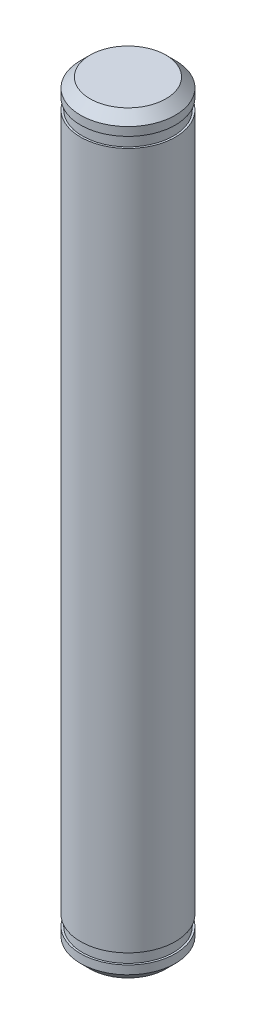
ISO-10303-21;
HEADER;
FILE_DESCRIPTION(('STEP AP214'),'2;1');
FILE_NAME('part.step','',(''),(''),'','','');
FILE_SCHEMA(('AUTOMOTIVE_DESIGN { 1 0 10303 214 1 1 1 1 }'));
ENDSEC;
DATA;
#1=APPLICATION_CONTEXT('core data for automotive mechanical design processes');
#2=APPLICATION_PROTOCOL_DEFINITION('international standard','automotive_design',2000,#1);
#3=PRODUCT_CONTEXT('',#1,'mechanical');
#4=PRODUCT('Part','Part','',(#3));
#5=PRODUCT_RELATED_PRODUCT_CATEGORY('part','',(#4));
#6=PRODUCT_DEFINITION_FORMATION('','',#4);
#7=PRODUCT_DEFINITION_CONTEXT('part definition',#1,'design');
#8=PRODUCT_DEFINITION('design','',#6,#7);
#9=PRODUCT_DEFINITION_SHAPE('','',#8);
#10=(LENGTH_UNIT() NAMED_UNIT(*) SI_UNIT(.MILLI.,.METRE.));
#11=(NAMED_UNIT(*) PLANE_ANGLE_UNIT() SI_UNIT($,.RADIAN.));
#12=(NAMED_UNIT(*) SI_UNIT($,.STERADIAN.) SOLID_ANGLE_UNIT());
#13=UNCERTAINTY_MEASURE_WITH_UNIT(LENGTH_MEASURE(1.E-05),#10,'distance_accuracy_value','');
#14=(GEOMETRIC_REPRESENTATION_CONTEXT(3) GLOBAL_UNCERTAINTY_ASSIGNED_CONTEXT((#13)) GLOBAL_UNIT_ASSIGNED_CONTEXT((#10,
#11,#12)) REPRESENTATION_CONTEXT('',''));
#15=CARTESIAN_POINT('',(0.,0.,0.));
#16=DIRECTION('',(0.,0.,1.));
#17=DIRECTION('',(1.,0.,0.));
#18=AXIS2_PLACEMENT_3D('',#15,#16,#17);
#19=CARTESIAN_POINT('',(0.,39.745,0.));
#20=DIRECTION('',(0.,1.,0.));
#21=DIRECTION('',(0.,0.,1.));
#22=AXIS2_PLACEMENT_3D('',#19,#20,#21);
#23=CYLINDRICAL_SURFACE('',#22,5.);
#24=CARTESIAN_POINT('',(0.,36.745,0.));
#25=DIRECTION('',(0.,1.,0.));
#26=DIRECTION('',(-1.,0.,0.));
#27=AXIS2_PLACEMENT_3D('',#24,#25,#26);
#28=CIRCLE('',#27,4.99999999999999);
#29=CARTESIAN_POINT('',(-4.99999999999998,36.745,0.));
#30=VERTEX_POINT('',#29);
#31=EDGE_CURVE('E57',#30,#30,#28,.T.);
#32=ORIENTED_EDGE('',*,*,#31,.F.);
#33=EDGE_LOOP('',(#32));
#34=FACE_BOUND('',#33,.T.);
#35=CARTESIAN_POINT('',(0.,-36.745,0.));
#36=DIRECTION('',(0.,1.,0.));
#37=DIRECTION('',(-1.,0.,0.));
#38=AXIS2_PLACEMENT_3D('',#35,#36,#37);
#39=CIRCLE('',#38,4.99999999999999);
#40=CARTESIAN_POINT('',(-4.99999999999997,-36.745,0.));
#41=VERTEX_POINT('',#40);
#42=EDGE_CURVE('E69',#41,#41,#39,.T.);
#43=ORIENTED_EDGE('',*,*,#42,.T.);
#44=EDGE_LOOP('',(#43));
#45=FACE_BOUND('',#44,.T.);
#46=ADVANCED_FACE('F35',(#34,#45),#23,.T.);
#47=CARTESIAN_POINT('',(0.,39.745,0.));
#48=DIRECTION('',(0.,-1.,0.));
#49=DIRECTION('',(0.,0.,-1.));
#50=AXIS2_PLACEMENT_3D('',#47,#48,#49);
#51=PLANE('',#50);
#52=CARTESIAN_POINT('',(0.,39.745,0.));
#53=DIRECTION('',(0.,-1.,0.));
#54=DIRECTION('',(0.,0.,-1.));
#55=AXIS2_PLACEMENT_3D('',#52,#53,#54);
#56=CIRCLE('',#55,3.99999999999999);
#57=CARTESIAN_POINT('',(0.,39.745,-3.99999999999999));
#58=VERTEX_POINT('',#57);
#59=EDGE_CURVE('E10',#58,#58,#56,.F.);
#60=ORIENTED_EDGE('',*,*,#59,.T.);
#61=EDGE_LOOP('',(#60));
#62=FACE_BOUND('',#61,.T.);
#63=ADVANCED_FACE('F110',(#62),#51,.F.);
#64=CARTESIAN_POINT('',(0.,37.845,0.));
#65=DIRECTION('',(0.,1.,0.));
#66=DIRECTION('',(-1.,0.,0.));
#67=AXIS2_PLACEMENT_3D('',#64,#65,#66);
#68=CIRCLE('',#67,4.99999999999999);
#69=CARTESIAN_POINT('',(-4.99999999999998,37.845,0.));
#70=VERTEX_POINT('',#69);
#71=EDGE_CURVE('E56',#70,#70,#68,.T.);
#72=ORIENTED_EDGE('',*,*,#71,.T.);
#73=EDGE_LOOP('',(#72));
#74=FACE_BOUND('',#73,.T.);
#75=CARTESIAN_POINT('',(0.,38.745,0.));
#76=DIRECTION('',(0.,-1.,0.));
#77=DIRECTION('',(0.,0.,-1.));
#78=AXIS2_PLACEMENT_3D('',#75,#76,#77);
#79=CIRCLE('',#78,5.);
#80=CARTESIAN_POINT('',(0.,38.745,-5.));
#81=VERTEX_POINT('',#80);
#82=EDGE_CURVE('E51',#81,#81,#79,.T.);
#83=ORIENTED_EDGE('',*,*,#82,.T.);
#84=EDGE_LOOP('',(#83));
#85=FACE_BOUND('',#84,.T.);
#86=ADVANCED_FACE('F97',(#74,#85),#23,.T.);
#87=CARTESIAN_POINT('',(0.,39.745,0.));
#88=DIRECTION('',(0.,-1.,0.));
#89=DIRECTION('',(0.,0.,-1.));
#90=AXIS2_PLACEMENT_3D('',#87,#88,#89);
#91=CONICAL_SURFACE('',#90,3.99999999999999,0.785398163397443);
#92=ORIENTED_EDGE('',*,*,#82,.F.);
#93=EDGE_LOOP('',(#92));
#94=FACE_BOUND('',#93,.T.);
#95=ORIENTED_EDGE('',*,*,#59,.F.);
#96=EDGE_LOOP('',(#95));
#97=FACE_BOUND('',#96,.T.);
#98=ADVANCED_FACE('F38',(#94,#97),#91,.T.);
#99=CARTESIAN_POINT('',(0.,37.845,0.));
#100=DIRECTION('',(0.,1.,0.));
#101=DIRECTION('',(-1.,0.,0.));
#102=AXIS2_PLACEMENT_3D('',#99,#100,#101);
#103=PLANE('',#102);
#104=ORIENTED_EDGE('',*,*,#71,.F.);
#105=EDGE_LOOP('',(#104));
#106=FACE_BOUND('',#105,.T.);
#107=CARTESIAN_POINT('',(0.,37.845,0.));
#108=DIRECTION('',(0.,1.,0.));
#109=DIRECTION('',(-1.,0.,0.));
#110=AXIS2_PLACEMENT_3D('',#107,#108,#109);
#111=CIRCLE('',#110,4.8);
#112=CARTESIAN_POINT('',(-4.79999999999998,37.845,0.));
#113=VERTEX_POINT('',#112);
#114=EDGE_CURVE('E60',#113,#113,#111,.T.);
#115=ORIENTED_EDGE('',*,*,#114,.T.);
#116=EDGE_LOOP('',(#115));
#117=FACE_BOUND('',#116,.T.);
#118=ADVANCED_FACE('F122',(#106,#117),#103,.F.);
#119=CARTESIAN_POINT('',(0.,36.745,0.));
#120=DIRECTION('',(0.,1.,0.));
#121=DIRECTION('',(-1.,0.,0.));
#122=AXIS2_PLACEMENT_3D('',#119,#120,#121);
#123=PLANE('',#122);
#124=ORIENTED_EDGE('',*,*,#31,.T.);
#125=EDGE_LOOP('',(#124));
#126=FACE_BOUND('',#125,.T.);
#127=CARTESIAN_POINT('',(0.,36.745,0.));
#128=DIRECTION('',(0.,1.,0.));
#129=DIRECTION('',(-1.,0.,0.));
#130=AXIS2_PLACEMENT_3D('',#127,#128,#129);
#131=CIRCLE('',#130,4.8);
#132=CARTESIAN_POINT('',(-4.79999999999998,36.745,0.));
#133=VERTEX_POINT('',#132);
#134=EDGE_CURVE('E63',#133,#133,#131,.T.);
#135=ORIENTED_EDGE('',*,*,#134,.F.);
#136=EDGE_LOOP('',(#135));
#137=FACE_BOUND('',#136,.T.);
#138=ADVANCED_FACE('F131',(#126,#137),#123,.T.);
#139=CARTESIAN_POINT('',(0.,37.845,0.));
#140=DIRECTION('',(0.,-1.,0.));
#141=DIRECTION('',(1.,0.,0.));
#142=AXIS2_PLACEMENT_3D('',#139,#140,#141);
#143=CYLINDRICAL_SURFACE('',#142,4.8);
#144=ORIENTED_EDGE('',*,*,#114,.F.);
#145=EDGE_LOOP('',(#144));
#146=FACE_BOUND('',#145,.T.);
#147=ORIENTED_EDGE('',*,*,#134,.T.);
#148=EDGE_LOOP('',(#147));
#149=FACE_BOUND('',#148,.T.);
#150=ADVANCED_FACE('F88',(#146,#149),#143,.T.);
#151=CARTESIAN_POINT('',(0.,-37.845,0.));
#152=DIRECTION('',(0.,-1.,0.));
#153=DIRECTION('',(-1.,0.,0.));
#154=AXIS2_PLACEMENT_3D('',#151,#152,#153);
#155=PLANE('',#154);
#156=CARTESIAN_POINT('',(0.,-37.845,0.));
#157=DIRECTION('',(0.,1.,0.));
#158=DIRECTION('',(-1.,0.,0.));
#159=AXIS2_PLACEMENT_3D('',#156,#157,#158);
#160=CIRCLE('',#159,4.8);
#161=CARTESIAN_POINT('',(-4.79999999999997,-37.845,0.));
#162=VERTEX_POINT('',#161);
#163=EDGE_CURVE('E72',#162,#162,#160,.T.);
#164=ORIENTED_EDGE('',*,*,#163,.F.);
#165=EDGE_LOOP('',(#164));
#166=FACE_BOUND('',#165,.T.);
#167=CARTESIAN_POINT('',(0.,-37.845,0.));
#168=DIRECTION('',(0.,1.,0.));
#169=DIRECTION('',(-1.,0.,0.));
#170=AXIS2_PLACEMENT_3D('',#167,#168,#169);
#171=CIRCLE('',#170,4.99999999999999);
#172=CARTESIAN_POINT('',(-4.99999999999997,-37.845,0.));
#173=VERTEX_POINT('',#172);
#174=EDGE_CURVE('E66',#173,#173,#171,.T.);
#175=ORIENTED_EDGE('',*,*,#174,.T.);
#176=EDGE_LOOP('',(#175));
#177=FACE_BOUND('',#176,.T.);
#178=ADVANCED_FACE('F84',(#166,#177),#155,.F.);
#179=CARTESIAN_POINT('',(0.,-36.745,0.));
#180=DIRECTION('',(0.,-1.,0.));
#181=DIRECTION('',(-1.,0.,0.));
#182=AXIS2_PLACEMENT_3D('',#179,#180,#181);
#183=PLANE('',#182);
#184=CARTESIAN_POINT('',(0.,-36.745,0.));
#185=DIRECTION('',(0.,1.,0.));
#186=DIRECTION('',(-1.,0.,0.));
#187=AXIS2_PLACEMENT_3D('',#184,#185,#186);
#188=CIRCLE('',#187,4.8);
#189=CARTESIAN_POINT('',(-4.79999999999997,-36.745,0.));
#190=VERTEX_POINT('',#189);
#191=EDGE_CURVE('E75',#190,#190,#188,.T.);
#192=ORIENTED_EDGE('',*,*,#191,.T.);
#193=EDGE_LOOP('',(#192));
#194=FACE_BOUND('',#193,.T.);
#195=ORIENTED_EDGE('',*,*,#42,.F.);
#196=EDGE_LOOP('',(#195));
#197=FACE_BOUND('',#196,.T.);
#198=ADVANCED_FACE('F87',(#194,#197),#183,.T.);
#199=CARTESIAN_POINT('',(0.,-37.845,0.));
#200=DIRECTION('',(0.,1.,0.));
#201=DIRECTION('',(-1.,0.,0.));
#202=AXIS2_PLACEMENT_3D('',#199,#200,#201);
#203=CYLINDRICAL_SURFACE('',#202,4.8);
#204=ORIENTED_EDGE('',*,*,#163,.T.);
#205=EDGE_LOOP('',(#204));
#206=FACE_BOUND('',#205,.T.);
#207=ORIENTED_EDGE('',*,*,#191,.F.);
#208=EDGE_LOOP('',(#207));
#209=FACE_BOUND('',#208,.T.);
#210=ADVANCED_FACE('F81',(#206,#209),#203,.T.);
#211=CARTESIAN_POINT('',(5.00000000000001,-39.745,0.));
#212=DIRECTION('',(0.,1.,0.));
#213=DIRECTION('',(0.,0.,1.));
#214=AXIS2_PLACEMENT_3D('',#211,#212,#213);
#215=PLANE('',#214);
#216=CARTESIAN_POINT('',(0.,-39.745,0.));
#217=DIRECTION('',(0.,1.,0.));
#218=DIRECTION('',(0.,0.,1.));
#219=AXIS2_PLACEMENT_3D('',#216,#217,#218);
#220=CIRCLE('',#219,3.99999999999999);
#221=CARTESIAN_POINT('',(0.,-39.745,3.99999999999999));
#222=VERTEX_POINT('',#221);
#223=EDGE_CURVE('E43',#222,#222,#220,.F.);
#224=ORIENTED_EDGE('',*,*,#223,.T.);
#225=EDGE_LOOP('',(#224));
#226=FACE_BOUND('',#225,.T.);
#227=ADVANCED_FACE('F101',(#226),#215,.F.);
#228=CARTESIAN_POINT('',(0.,-38.745,0.));
#229=DIRECTION('',(0.,1.,0.));
#230=DIRECTION('',(0.,0.,1.));
#231=AXIS2_PLACEMENT_3D('',#228,#229,#230);
#232=CONICAL_SURFACE('',#231,5.,0.785398163397453);
#233=ORIENTED_EDGE('',*,*,#223,.F.);
#234=EDGE_LOOP('',(#233));
#235=FACE_BOUND('',#234,.T.);
#236=CARTESIAN_POINT('',(0.,-38.745,0.));
#237=DIRECTION('',(0.,1.,0.));
#238=DIRECTION('',(0.,0.,1.));
#239=AXIS2_PLACEMENT_3D('',#236,#237,#238);
#240=CIRCLE('',#239,5.);
#241=CARTESIAN_POINT('',(0.,-38.745,5.));
#242=VERTEX_POINT('',#241);
#243=EDGE_CURVE('E47',#242,#242,#240,.T.);
#244=ORIENTED_EDGE('',*,*,#243,.F.);
#245=EDGE_LOOP('',(#244));
#246=FACE_BOUND('',#245,.T.);
#247=ADVANCED_FACE('F95',(#235,#246),#232,.T.);
#248=ORIENTED_EDGE('',*,*,#174,.F.);
#249=EDGE_LOOP('',(#248));
#250=FACE_BOUND('',#249,.T.);
#251=ORIENTED_EDGE('',*,*,#243,.T.);
#252=EDGE_LOOP('',(#251));
#253=FACE_BOUND('',#252,.T.);
#254=ADVANCED_FACE('F92',(#250,#253),#23,.T.);
#255=CLOSED_SHELL('',(#46,#63,#86,#98,#118,#138,#150,#178,#198,#210,#227,#247,#254));
#256=MANIFOLD_SOLID_BREP('B2',#255);
#257=ADVANCED_BREP_SHAPE_REPRESENTATION('',(#18,#256),#14);
#258=SHAPE_DEFINITION_REPRESENTATION(#9,#257);
ENDSEC;
END-ISO-10303-21;
